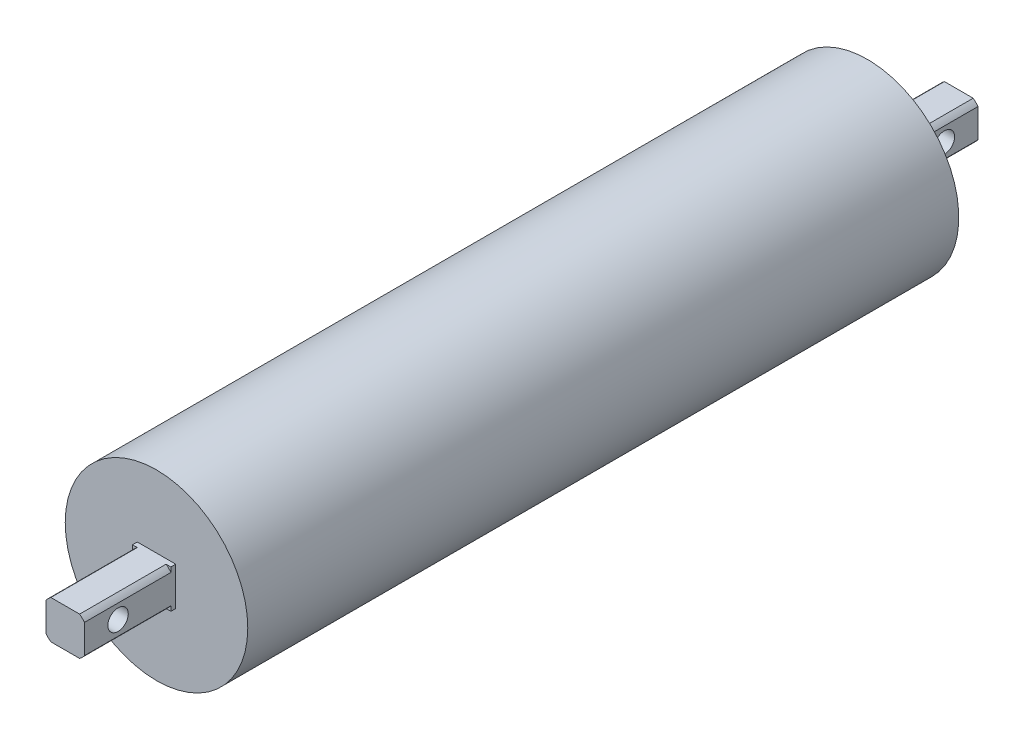
ISO-10303-21;
HEADER;
FILE_DESCRIPTION(('STEP AP214'),'2;1');
FILE_NAME('part.step','',(''),(''),'','','');
FILE_SCHEMA(('AUTOMOTIVE_DESIGN { 1 0 10303 214 1 1 1 1 }'));
ENDSEC;
DATA;
#1=APPLICATION_CONTEXT('core data for automotive mechanical design processes');
#2=APPLICATION_PROTOCOL_DEFINITION('international standard','automotive_design',2000,#1);
#3=PRODUCT_CONTEXT('',#1,'mechanical');
#4=PRODUCT('Part','Part','',(#3));
#5=PRODUCT_RELATED_PRODUCT_CATEGORY('part','',(#4));
#6=PRODUCT_DEFINITION_FORMATION('','',#4);
#7=PRODUCT_DEFINITION_CONTEXT('part definition',#1,'design');
#8=PRODUCT_DEFINITION('design','',#6,#7);
#9=PRODUCT_DEFINITION_SHAPE('','',#8);
#10=(LENGTH_UNIT() NAMED_UNIT(*) SI_UNIT(.MILLI.,.METRE.));
#11=(NAMED_UNIT(*) PLANE_ANGLE_UNIT() SI_UNIT($,.RADIAN.));
#12=(NAMED_UNIT(*) SI_UNIT($,.STERADIAN.) SOLID_ANGLE_UNIT());
#13=UNCERTAINTY_MEASURE_WITH_UNIT(LENGTH_MEASURE(1.E-05),#10,'distance_accuracy_value','');
#14=(GEOMETRIC_REPRESENTATION_CONTEXT(3) GLOBAL_UNCERTAINTY_ASSIGNED_CONTEXT((#13)) GLOBAL_UNIT_ASSIGNED_CONTEXT((#10,
#11,#12)) REPRESENTATION_CONTEXT('',''));
#15=CARTESIAN_POINT('',(0.,0.,0.));
#16=DIRECTION('',(0.,0.,1.));
#17=DIRECTION('',(1.,0.,0.));
#18=AXIS2_PLACEMENT_3D('',#15,#16,#17);
#19=CARTESIAN_POINT('',(0.,0.,150.));
#20=DIRECTION('',(0.,0.,-1.));
#21=DIRECTION('',(-1.,0.,0.));
#22=AXIS2_PLACEMENT_3D('',#19,#20,#21);
#23=CYLINDRICAL_SURFACE('',#22,38.);
#24=CARTESIAN_POINT('',(0.,0.,148.));
#25=DIRECTION('',(0.,0.,1.));
#26=DIRECTION('',(1.,0.,0.));
#27=AXIS2_PLACEMENT_3D('',#24,#25,#26);
#28=CIRCLE('',#27,38.);
#29=CARTESIAN_POINT('',(38.,0.,148.));
#30=VERTEX_POINT('',#29);
#31=EDGE_CURVE('E361',#30,#30,#28,.T.);
#32=ORIENTED_EDGE('',*,*,#31,.F.);
#33=EDGE_LOOP('',(#32));
#34=FACE_BOUND('',#33,.T.);
#35=CARTESIAN_POINT('',(0.,0.,-148.));
#36=DIRECTION('',(0.,0.,-1.));
#37=DIRECTION('',(-1.,0.,0.));
#38=AXIS2_PLACEMENT_3D('',#35,#36,#37);
#39=CIRCLE('',#38,38.);
#40=CARTESIAN_POINT('',(-38.,0.,-148.));
#41=VERTEX_POINT('',#40);
#42=EDGE_CURVE('E369',#41,#41,#39,.T.);
#43=ORIENTED_EDGE('',*,*,#42,.F.);
#44=EDGE_LOOP('',(#43));
#45=FACE_BOUND('',#44,.T.);
#46=ADVANCED_FACE('F43',(#34,#45),#23,.T.);
#47=CARTESIAN_POINT('',(0.,0.,148.));
#48=DIRECTION('',(0.,0.,1.));
#49=DIRECTION('',(1.,0.,0.));
#50=AXIS2_PLACEMENT_3D('',#47,#48,#49);
#51=PLANE('',#50);
#52=DIRECTION('',(-1.,0.,0.));
#53=VECTOR('',#52,1.);
#54=CARTESIAN_POINT('',(8.,8.,148.));
#55=LINE('',#54,#53);
#56=CARTESIAN_POINT('',(8.,8.,148.));
#57=VERTEX_POINT('',#56);
#58=CARTESIAN_POINT('',(-8.,8.,148.));
#59=VERTEX_POINT('',#58);
#60=EDGE_CURVE('E293',#57,#59,#55,.T.);
#61=ORIENTED_EDGE('',*,*,#60,.F.);
#62=DIRECTION('',(0.,1.,0.));
#63=VECTOR('',#62,1.);
#64=CARTESIAN_POINT('',(8.,-8.,148.));
#65=LINE('',#64,#63);
#66=CARTESIAN_POINT('',(8.,-8.,148.));
#67=VERTEX_POINT('',#66);
#68=EDGE_CURVE('E290',#67,#57,#65,.T.);
#69=ORIENTED_EDGE('',*,*,#68,.F.);
#70=DIRECTION('',(1.,0.,0.));
#71=VECTOR('',#70,1.);
#72=CARTESIAN_POINT('',(8.,-8.,148.));
#73=LINE('',#72,#71);
#74=CARTESIAN_POINT('',(-8.,-8.,148.));
#75=VERTEX_POINT('',#74);
#76=EDGE_CURVE('E287',#75,#67,#73,.T.);
#77=ORIENTED_EDGE('',*,*,#76,.F.);
#78=DIRECTION('',(0.,-1.,0.));
#79=VECTOR('',#78,1.);
#80=CARTESIAN_POINT('',(-8.,-8.,148.));
#81=LINE('',#80,#79);
#82=EDGE_CURVE('E284',#59,#75,#81,.T.);
#83=ORIENTED_EDGE('',*,*,#82,.F.);
#84=EDGE_LOOP('',(#61,#69,#77,#83));
#85=FACE_BOUND('',#84,.T.);
#86=ORIENTED_EDGE('',*,*,#31,.T.);
#87=EDGE_LOOP('',(#86));
#88=FACE_BOUND('',#87,.T.);
#89=ADVANCED_FACE('F436',(#85,#88),#51,.T.);
#90=CARTESIAN_POINT('',(-8.,-8.,148.));
#91=DIRECTION('',(-1.,0.,0.));
#92=DIRECTION('',(0.,-1.,0.));
#93=AXIS2_PLACEMENT_3D('',#90,#91,#92);
#94=PLANE('',#93);
#95=CARTESIAN_POINT('',(-8.,0.,172.));
#96=DIRECTION('',(-1.,0.,0.));
#97=DIRECTION('',(0.,0.,1.));
#98=AXIS2_PLACEMENT_3D('',#95,#96,#97);
#99=CIRCLE('',#98,4.24999999999999);
#100=CARTESIAN_POINT('',(-8.,0.,176.25));
#101=VERTEX_POINT('',#100);
#102=EDGE_CURVE('E273',#101,#101,#99,.T.);
#103=ORIENTED_EDGE('',*,*,#102,.F.);
#104=EDGE_LOOP('',(#103));
#105=FACE_BOUND('',#104,.T.);
#106=DIRECTION('',(0.,0.,1.));
#107=VECTOR('',#106,1.);
#108=CARTESIAN_POINT('',(-8.,8.,148.));
#109=LINE('',#108,#107);
#110=CARTESIAN_POINT('',(-8.,8.,150.));
#111=VERTEX_POINT('',#110);
#112=EDGE_CURVE('E297',#59,#111,#109,.T.);
#113=ORIENTED_EDGE('',*,*,#112,.F.);
#114=ORIENTED_EDGE('',*,*,#82,.T.);
#115=DIRECTION('',(0.,0.,1.));
#116=VECTOR('',#115,1.);
#117=CARTESIAN_POINT('',(-8.,-8.,148.));
#118=LINE('',#117,#116);
#119=CARTESIAN_POINT('',(-8.,-8.,150.));
#120=VERTEX_POINT('',#119);
#121=EDGE_CURVE('E296',#75,#120,#118,.T.);
#122=ORIENTED_EDGE('',*,*,#121,.T.);
#123=DIRECTION('',(0.,-1.,0.));
#124=VECTOR('',#123,1.);
#125=CARTESIAN_POINT('',(-8.,0.,150.));
#126=LINE('',#125,#124);
#127=CARTESIAN_POINT('',(-8.,-6.,150.));
#128=VERTEX_POINT('',#127);
#129=EDGE_CURVE('E333',#128,#120,#126,.T.);
#130=ORIENTED_EDGE('',*,*,#129,.F.);
#131=DIRECTION('',(0.,0.,-1.));
#132=VECTOR('',#131,1.);
#133=CARTESIAN_POINT('',(-8.,-6.,186.));
#134=LINE('',#133,#132);
#135=CARTESIAN_POINT('',(-8.,-6.,186.));
#136=VERTEX_POINT('',#135);
#137=EDGE_CURVE('E331',#128,#136,#134,.F.);
#138=ORIENTED_EDGE('',*,*,#137,.T.);
#139=DIRECTION('',(0.,-1.,0.));
#140=VECTOR('',#139,1.);
#141=CARTESIAN_POINT('',(-8.,0.,186.));
#142=LINE('',#141,#140);
#143=CARTESIAN_POINT('',(-8.,6.,186.));
#144=VERTEX_POINT('',#143);
#145=EDGE_CURVE('E357',#144,#136,#142,.T.);
#146=ORIENTED_EDGE('',*,*,#145,.F.);
#147=DIRECTION('',(0.,0.,-1.));
#148=VECTOR('',#147,1.);
#149=CARTESIAN_POINT('',(-8.,6.,186.));
#150=LINE('',#149,#148);
#151=CARTESIAN_POINT('',(-8.,6.,150.));
#152=VERTEX_POINT('',#151);
#153=EDGE_CURVE('E336',#144,#152,#150,.T.);
#154=ORIENTED_EDGE('',*,*,#153,.T.);
#155=EDGE_CURVE('E337',#111,#152,#126,.T.);
#156=ORIENTED_EDGE('',*,*,#155,.F.);
#157=EDGE_LOOP('',(#113,#114,#122,#130,#138,#146,#154,#156));
#158=FACE_BOUND('',#157,.T.);
#159=ADVANCED_FACE('F443',(#105,#158),#94,.T.);
#160=CARTESIAN_POINT('',(8.,8.,148.));
#161=DIRECTION('',(0.,1.,0.));
#162=DIRECTION('',(-1.,0.,0.));
#163=AXIS2_PLACEMENT_3D('',#160,#161,#162);
#164=PLANE('',#163);
#165=DIRECTION('',(0.,0.,1.));
#166=VECTOR('',#165,1.);
#167=CARTESIAN_POINT('',(8.,8.,148.));
#168=LINE('',#167,#166);
#169=CARTESIAN_POINT('',(8.,8.,150.));
#170=VERTEX_POINT('',#169);
#171=EDGE_CURVE('E300',#57,#170,#168,.T.);
#172=ORIENTED_EDGE('',*,*,#171,.F.);
#173=ORIENTED_EDGE('',*,*,#60,.T.);
#174=ORIENTED_EDGE('',*,*,#112,.T.);
#175=DIRECTION('',(-1.,0.,0.));
#176=VECTOR('',#175,1.);
#177=CARTESIAN_POINT('',(0.,8.,150.));
#178=LINE('',#177,#176);
#179=CARTESIAN_POINT('',(-6.,8.,150.));
#180=VERTEX_POINT('',#179);
#181=EDGE_CURVE('E325',#180,#111,#178,.T.);
#182=ORIENTED_EDGE('',*,*,#181,.F.);
#183=DIRECTION('',(0.,0.,-1.));
#184=VECTOR('',#183,1.);
#185=CARTESIAN_POINT('',(-6.,8.,186.));
#186=LINE('',#185,#184);
#187=CARTESIAN_POINT('',(-5.99999999999999,8.,186.));
#188=VERTEX_POINT('',#187);
#189=EDGE_CURVE('E323',#180,#188,#186,.F.);
#190=ORIENTED_EDGE('',*,*,#189,.T.);
#191=DIRECTION('',(-1.,0.,0.));
#192=VECTOR('',#191,1.);
#193=CARTESIAN_POINT('',(0.,8.,186.));
#194=LINE('',#193,#192);
#195=CARTESIAN_POINT('',(5.99999999999999,8.,186.));
#196=VERTEX_POINT('',#195);
#197=EDGE_CURVE('E354',#196,#188,#194,.T.);
#198=ORIENTED_EDGE('',*,*,#197,.F.);
#199=DIRECTION('',(0.,0.,-1.));
#200=VECTOR('',#199,1.);
#201=CARTESIAN_POINT('',(5.99999999999999,8.,186.));
#202=LINE('',#201,#200);
#203=CARTESIAN_POINT('',(5.99999999999999,8.,150.));
#204=VERTEX_POINT('',#203);
#205=EDGE_CURVE('E328',#196,#204,#202,.T.);
#206=ORIENTED_EDGE('',*,*,#205,.T.);
#207=EDGE_CURVE('E329',#170,#204,#178,.T.);
#208=ORIENTED_EDGE('',*,*,#207,.F.);
#209=EDGE_LOOP('',(#172,#173,#174,#182,#190,#198,#206,#208));
#210=FACE_BOUND('',#209,.T.);
#211=ADVANCED_FACE('F453',(#210),#164,.T.);
#212=CARTESIAN_POINT('',(8.,-8.,148.));
#213=DIRECTION('',(1.,0.,0.));
#214=DIRECTION('',(0.,1.,0.));
#215=AXIS2_PLACEMENT_3D('',#212,#213,#214);
#216=PLANE('',#215);
#217=CARTESIAN_POINT('',(8.,0.,172.));
#218=DIRECTION('',(1.,0.,0.));
#219=DIRECTION('',(0.,1.,0.));
#220=AXIS2_PLACEMENT_3D('',#217,#218,#219);
#221=CIRCLE('',#220,4.24999999999999);
#222=CARTESIAN_POINT('',(8.,4.24999999999999,172.));
#223=VERTEX_POINT('',#222);
#224=EDGE_CURVE('E283',#223,#223,#221,.T.);
#225=ORIENTED_EDGE('',*,*,#224,.F.);
#226=EDGE_LOOP('',(#225));
#227=FACE_BOUND('',#226,.T.);
#228=DIRECTION('',(0.,0.,1.));
#229=VECTOR('',#228,1.);
#230=CARTESIAN_POINT('',(8.,-8.,148.));
#231=LINE('',#230,#229);
#232=CARTESIAN_POINT('',(8.,-8.,150.));
#233=VERTEX_POINT('',#232);
#234=EDGE_CURVE('E303',#67,#233,#231,.T.);
#235=ORIENTED_EDGE('',*,*,#234,.F.);
#236=ORIENTED_EDGE('',*,*,#68,.T.);
#237=ORIENTED_EDGE('',*,*,#171,.T.);
#238=DIRECTION('',(0.,1.,0.));
#239=VECTOR('',#238,1.);
#240=CARTESIAN_POINT('',(8.,0.,150.));
#241=LINE('',#240,#239);
#242=CARTESIAN_POINT('',(8.,6.,150.));
#243=VERTEX_POINT('',#242);
#244=EDGE_CURVE('E317',#243,#170,#241,.T.);
#245=ORIENTED_EDGE('',*,*,#244,.F.);
#246=DIRECTION('',(0.,0.,-1.));
#247=VECTOR('',#246,1.);
#248=CARTESIAN_POINT('',(8.,6.,186.));
#249=LINE('',#248,#247);
#250=CARTESIAN_POINT('',(8.,6.,186.));
#251=VERTEX_POINT('',#250);
#252=EDGE_CURVE('E315',#243,#251,#249,.F.);
#253=ORIENTED_EDGE('',*,*,#252,.T.);
#254=DIRECTION('',(0.,1.,0.));
#255=VECTOR('',#254,1.);
#256=CARTESIAN_POINT('',(8.,0.,186.));
#257=LINE('',#256,#255);
#258=CARTESIAN_POINT('',(8.,-6.,186.));
#259=VERTEX_POINT('',#258);
#260=EDGE_CURVE('E351',#259,#251,#257,.T.);
#261=ORIENTED_EDGE('',*,*,#260,.F.);
#262=DIRECTION('',(0.,0.,-1.));
#263=VECTOR('',#262,1.);
#264=CARTESIAN_POINT('',(8.,-6.,186.));
#265=LINE('',#264,#263);
#266=CARTESIAN_POINT('',(8.,-6.,150.));
#267=VERTEX_POINT('',#266);
#268=EDGE_CURVE('E320',#259,#267,#265,.T.);
#269=ORIENTED_EDGE('',*,*,#268,.T.);
#270=EDGE_CURVE('E321',#233,#267,#241,.T.);
#271=ORIENTED_EDGE('',*,*,#270,.F.);
#272=EDGE_LOOP('',(#235,#236,#237,#245,#253,#261,#269,#271));
#273=FACE_BOUND('',#272,.T.);
#274=ADVANCED_FACE('F540',(#227,#273),#216,.T.);
#275=CARTESIAN_POINT('',(8.,-8.,148.));
#276=DIRECTION('',(0.,-1.,0.));
#277=DIRECTION('',(1.,0.,0.));
#278=AXIS2_PLACEMENT_3D('',#275,#276,#277);
#279=PLANE('',#278);
#280=ORIENTED_EDGE('',*,*,#121,.F.);
#281=ORIENTED_EDGE('',*,*,#76,.T.);
#282=ORIENTED_EDGE('',*,*,#234,.T.);
#283=DIRECTION('',(1.,0.,0.));
#284=VECTOR('',#283,1.);
#285=CARTESIAN_POINT('',(0.,-8.,150.));
#286=LINE('',#285,#284);
#287=CARTESIAN_POINT('',(6.,-8.,150.));
#288=VERTEX_POINT('',#287);
#289=EDGE_CURVE('E309',#288,#233,#286,.T.);
#290=ORIENTED_EDGE('',*,*,#289,.F.);
#291=DIRECTION('',(0.,0.,-1.));
#292=VECTOR('',#291,1.);
#293=CARTESIAN_POINT('',(6.,-8.,186.));
#294=LINE('',#293,#292);
#295=CARTESIAN_POINT('',(6.,-8.,186.));
#296=VERTEX_POINT('',#295);
#297=EDGE_CURVE('E67',#288,#296,#294,.F.);
#298=ORIENTED_EDGE('',*,*,#297,.T.);
#299=DIRECTION('',(1.,0.,0.));
#300=VECTOR('',#299,1.);
#301=CARTESIAN_POINT('',(0.,-8.,186.));
#302=LINE('',#301,#300);
#303=CARTESIAN_POINT('',(-6.,-8.,186.));
#304=VERTEX_POINT('',#303);
#305=EDGE_CURVE('E348',#304,#296,#302,.T.);
#306=ORIENTED_EDGE('',*,*,#305,.F.);
#307=DIRECTION('',(0.,0.,-1.));
#308=VECTOR('',#307,1.);
#309=CARTESIAN_POINT('',(-6.,-8.,186.));
#310=LINE('',#309,#308);
#311=CARTESIAN_POINT('',(-6.,-8.,150.));
#312=VERTEX_POINT('',#311);
#313=EDGE_CURVE('E312',#304,#312,#310,.T.);
#314=ORIENTED_EDGE('',*,*,#313,.T.);
#315=EDGE_CURVE('E313',#120,#312,#286,.T.);
#316=ORIENTED_EDGE('',*,*,#315,.F.);
#317=EDGE_LOOP('',(#280,#281,#282,#290,#298,#306,#314,#316));
#318=FACE_BOUND('',#317,.T.);
#319=ADVANCED_FACE('F463',(#318),#279,.T.);
#320=CARTESIAN_POINT('',(0.,0.,186.));
#321=DIRECTION('',(0.,0.,1.));
#322=DIRECTION('',(1.,0.,0.));
#323=AXIS2_PLACEMENT_3D('',#320,#321,#322);
#324=PLANE('',#323);
#325=CARTESIAN_POINT('',(0.,0.,186.));
#326=DIRECTION('',(0.,0.,1.));
#327=DIRECTION('',(1.,0.,0.));
#328=AXIS2_PLACEMENT_3D('',#325,#326,#327);
#329=CIRCLE('',#328,10.);
#330=EDGE_CURVE('E343',#188,#144,#329,.T.);
#331=ORIENTED_EDGE('',*,*,#330,.T.);
#332=ORIENTED_EDGE('',*,*,#145,.T.);
#333=EDGE_CURVE('E498',#136,#304,#329,.T.);
#334=ORIENTED_EDGE('',*,*,#333,.T.);
#335=ORIENTED_EDGE('',*,*,#305,.T.);
#336=EDGE_CURVE('E344',#296,#259,#329,.T.);
#337=ORIENTED_EDGE('',*,*,#336,.T.);
#338=ORIENTED_EDGE('',*,*,#260,.T.);
#339=EDGE_CURVE('E339',#251,#196,#329,.T.);
#340=ORIENTED_EDGE('',*,*,#339,.T.);
#341=ORIENTED_EDGE('',*,*,#197,.T.);
#342=EDGE_LOOP('',(#331,#332,#334,#335,#337,#338,#340,#341));
#343=FACE_BOUND('',#342,.T.);
#344=ADVANCED_FACE('F459',(#343),#324,.T.);
#345=CARTESIAN_POINT('',(0.,0.,186.));
#346=DIRECTION('',(0.,0.,-1.));
#347=DIRECTION('',(-1.,0.,0.));
#348=AXIS2_PLACEMENT_3D('',#345,#346,#347);
#349=CYLINDRICAL_SURFACE('',#348,10.);
#350=ORIENTED_EDGE('',*,*,#268,.F.);
#351=ORIENTED_EDGE('',*,*,#336,.F.);
#352=ORIENTED_EDGE('',*,*,#297,.F.);
#353=CARTESIAN_POINT('',(0.,0.,150.));
#354=DIRECTION('',(0.,0.,1.));
#355=DIRECTION('',(1.,0.,0.));
#356=AXIS2_PLACEMENT_3D('',#353,#354,#355);
#357=CIRCLE('',#356,10.);
#358=EDGE_CURVE('E342',#288,#267,#357,.T.);
#359=ORIENTED_EDGE('',*,*,#358,.T.);
#360=EDGE_LOOP('',(#350,#351,#352,#359));
#361=FACE_BOUND('',#360,.T.);
#362=ADVANCED_FACE('F462',(#361),#349,.T.);
#363=ORIENTED_EDGE('',*,*,#137,.F.);
#364=EDGE_CURVE('E516',#128,#312,#357,.T.);
#365=ORIENTED_EDGE('',*,*,#364,.T.);
#366=ORIENTED_EDGE('',*,*,#313,.F.);
#367=ORIENTED_EDGE('',*,*,#333,.F.);
#368=EDGE_LOOP('',(#363,#365,#366,#367));
#369=FACE_BOUND('',#368,.T.);
#370=ADVANCED_FACE('F470',(#369),#349,.T.);
#371=ORIENTED_EDGE('',*,*,#205,.F.);
#372=ORIENTED_EDGE('',*,*,#339,.F.);
#373=ORIENTED_EDGE('',*,*,#252,.F.);
#374=EDGE_CURVE('E345',#243,#204,#357,.T.);
#375=ORIENTED_EDGE('',*,*,#374,.T.);
#376=EDGE_LOOP('',(#371,#372,#373,#375));
#377=FACE_BOUND('',#376,.T.);
#378=ADVANCED_FACE('F468',(#377),#349,.T.);
#379=ORIENTED_EDGE('',*,*,#153,.F.);
#380=ORIENTED_EDGE('',*,*,#330,.F.);
#381=ORIENTED_EDGE('',*,*,#189,.F.);
#382=EDGE_CURVE('E349',#180,#152,#357,.T.);
#383=ORIENTED_EDGE('',*,*,#382,.T.);
#384=EDGE_LOOP('',(#379,#380,#381,#383));
#385=FACE_BOUND('',#384,.T.);
#386=ADVANCED_FACE('F465',(#385),#349,.T.);
#387=CARTESIAN_POINT('',(0.,0.,150.));
#388=DIRECTION('',(0.,0.,1.));
#389=DIRECTION('',(1.,0.,0.));
#390=AXIS2_PLACEMENT_3D('',#387,#388,#389);
#391=PLANE('',#390);
#392=ORIENTED_EDGE('',*,*,#289,.T.);
#393=ORIENTED_EDGE('',*,*,#270,.T.);
#394=ORIENTED_EDGE('',*,*,#358,.F.);
#395=EDGE_LOOP('',(#392,#393,#394));
#396=FACE_BOUND('',#395,.T.);
#397=ADVANCED_FACE('F467',(#396),#391,.T.);
#398=ORIENTED_EDGE('',*,*,#364,.F.);
#399=ORIENTED_EDGE('',*,*,#129,.T.);
#400=ORIENTED_EDGE('',*,*,#315,.T.);
#401=EDGE_LOOP('',(#398,#399,#400));
#402=FACE_BOUND('',#401,.T.);
#403=ADVANCED_FACE('F482',(#402),#391,.T.);
#404=ORIENTED_EDGE('',*,*,#244,.T.);
#405=ORIENTED_EDGE('',*,*,#207,.T.);
#406=ORIENTED_EDGE('',*,*,#374,.F.);
#407=EDGE_LOOP('',(#404,#405,#406));
#408=FACE_BOUND('',#407,.T.);
#409=ADVANCED_FACE('F474',(#408),#391,.T.);
#410=ORIENTED_EDGE('',*,*,#181,.T.);
#411=ORIENTED_EDGE('',*,*,#155,.T.);
#412=ORIENTED_EDGE('',*,*,#382,.F.);
#413=EDGE_LOOP('',(#410,#411,#412));
#414=FACE_BOUND('',#413,.T.);
#415=ADVANCED_FACE('F471',(#414),#391,.T.);
#416=CARTESIAN_POINT('',(-8.,0.,172.));
#417=DIRECTION('',(-1.,0.,0.));
#418=DIRECTION('',(0.,0.,1.));
#419=AXIS2_PLACEMENT_3D('',#416,#417,#418);
#420=CYLINDRICAL_SURFACE('',#419,4.24999999999999);
#421=ORIENTED_EDGE('',*,*,#224,.T.);
#422=EDGE_LOOP('',(#421));
#423=FACE_BOUND('',#422,.T.);
#424=ORIENTED_EDGE('',*,*,#102,.T.);
#425=EDGE_LOOP('',(#424));
#426=FACE_BOUND('',#425,.T.);
#427=ADVANCED_FACE('F473',(#423,#426),#420,.F.);
#428=CARTESIAN_POINT('',(0.,0.,-148.));
#429=DIRECTION('',(0.,0.,-1.));
#430=DIRECTION('',(-1.,0.,0.));
#431=AXIS2_PLACEMENT_3D('',#428,#429,#430);
#432=PLANE('',#431);
#433=DIRECTION('',(0.,-1.,0.));
#434=VECTOR('',#433,1.);
#435=CARTESIAN_POINT('',(-8.,-8.,-148.));
#436=LINE('',#435,#434);
#437=CARTESIAN_POINT('',(-8.,8.,-148.));
#438=VERTEX_POINT('',#437);
#439=CARTESIAN_POINT('',(-8.,-8.,-148.));
#440=VERTEX_POINT('',#439);
#441=EDGE_CURVE('E209',#438,#440,#436,.T.);
#442=ORIENTED_EDGE('',*,*,#441,.T.);
#443=DIRECTION('',(1.,0.,0.));
#444=VECTOR('',#443,1.);
#445=CARTESIAN_POINT('',(8.,-8.,-148.));
#446=LINE('',#445,#444);
#447=CARTESIAN_POINT('',(8.,-8.,-148.));
#448=VERTEX_POINT('',#447);
#449=EDGE_CURVE('E223',#440,#448,#446,.T.);
#450=ORIENTED_EDGE('',*,*,#449,.T.);
#451=DIRECTION('',(0.,1.,0.));
#452=VECTOR('',#451,1.);
#453=CARTESIAN_POINT('',(8.,-8.,-148.));
#454=LINE('',#453,#452);
#455=CARTESIAN_POINT('',(8.,8.,-148.));
#456=VERTEX_POINT('',#455);
#457=EDGE_CURVE('E212',#448,#456,#454,.T.);
#458=ORIENTED_EDGE('',*,*,#457,.T.);
#459=DIRECTION('',(-1.,0.,0.));
#460=VECTOR('',#459,1.);
#461=CARTESIAN_POINT('',(8.,8.,-148.));
#462=LINE('',#461,#460);
#463=EDGE_CURVE('E204',#456,#438,#462,.T.);
#464=ORIENTED_EDGE('',*,*,#463,.T.);
#465=EDGE_LOOP('',(#442,#450,#458,#464));
#466=FACE_BOUND('',#465,.T.);
#467=ORIENTED_EDGE('',*,*,#42,.T.);
#468=EDGE_LOOP('',(#467));
#469=FACE_BOUND('',#468,.T.);
#470=ADVANCED_FACE('F206',(#466,#469),#432,.T.);
#471=CARTESIAN_POINT('',(-8.,-8.,-148.));
#472=DIRECTION('',(1.,0.,0.));
#473=DIRECTION('',(0.,1.,0.));
#474=AXIS2_PLACEMENT_3D('',#471,#472,#473);
#475=PLANE('',#474);
#476=CARTESIAN_POINT('',(-8.,0.,-172.));
#477=DIRECTION('',(-1.,0.,0.));
#478=DIRECTION('',(0.,0.,1.));
#479=AXIS2_PLACEMENT_3D('',#476,#477,#478);
#480=CIRCLE('',#479,4.24999999999999);
#481=CARTESIAN_POINT('',(-8.,0.,-167.75));
#482=VERTEX_POINT('',#481);
#483=EDGE_CURVE('E231',#482,#482,#480,.T.);
#484=ORIENTED_EDGE('',*,*,#483,.F.);
#485=EDGE_LOOP('',(#484));
#486=FACE_BOUND('',#485,.T.);
#487=DIRECTION('',(0.,0.,1.));
#488=VECTOR('',#487,1.);
#489=CARTESIAN_POINT('',(-8.,6.,-186.));
#490=LINE('',#489,#488);
#491=CARTESIAN_POINT('',(-8.,6.,-150.));
#492=VERTEX_POINT('',#491);
#493=CARTESIAN_POINT('',(-8.,6.,-186.));
#494=VERTEX_POINT('',#493);
#495=EDGE_CURVE('E267',#492,#494,#490,.F.);
#496=ORIENTED_EDGE('',*,*,#495,.T.);
#497=DIRECTION('',(0.,-1.,0.));
#498=VECTOR('',#497,1.);
#499=CARTESIAN_POINT('',(-8.,0.,-186.));
#500=LINE('',#499,#498);
#501=CARTESIAN_POINT('',(-8.,-6.,-186.));
#502=VERTEX_POINT('',#501);
#503=EDGE_CURVE('E12',#494,#502,#500,.T.);
#504=ORIENTED_EDGE('',*,*,#503,.T.);
#505=DIRECTION('',(0.,0.,1.));
#506=VECTOR('',#505,1.);
#507=CARTESIAN_POINT('',(-8.,-6.,-186.));
#508=LINE('',#507,#506);
#509=CARTESIAN_POINT('',(-8.,-6.,-150.));
#510=VERTEX_POINT('',#509);
#511=EDGE_CURVE('E262',#502,#510,#508,.T.);
#512=ORIENTED_EDGE('',*,*,#511,.T.);
#513=DIRECTION('',(0.,1.,0.));
#514=VECTOR('',#513,1.);
#515=CARTESIAN_POINT('',(-8.,0.,-150.));
#516=LINE('',#515,#514);
#517=CARTESIAN_POINT('',(-8.,-8.,-150.));
#518=VERTEX_POINT('',#517);
#519=EDGE_CURVE('E264',#518,#510,#516,.T.);
#520=ORIENTED_EDGE('',*,*,#519,.F.);
#521=DIRECTION('',(0.,0.,-1.));
#522=VECTOR('',#521,1.);
#523=CARTESIAN_POINT('',(-8.,-8.,-148.));
#524=LINE('',#523,#522);
#525=EDGE_CURVE('E227',#440,#518,#524,.T.);
#526=ORIENTED_EDGE('',*,*,#525,.F.);
#527=ORIENTED_EDGE('',*,*,#441,.F.);
#528=DIRECTION('',(0.,0.,-1.));
#529=VECTOR('',#528,1.);
#530=CARTESIAN_POINT('',(-8.,8.,-148.));
#531=LINE('',#530,#529);
#532=CARTESIAN_POINT('',(-8.,8.,-150.));
#533=VERTEX_POINT('',#532);
#534=EDGE_CURVE('E216',#438,#533,#531,.T.);
#535=ORIENTED_EDGE('',*,*,#534,.T.);
#536=EDGE_CURVE('E268',#492,#533,#516,.T.);
#537=ORIENTED_EDGE('',*,*,#536,.F.);
#538=EDGE_LOOP('',(#496,#504,#512,#520,#526,#527,#535,#537));
#539=FACE_BOUND('',#538,.T.);
#540=ADVANCED_FACE('F225',(#486,#539),#475,.F.);
#541=CARTESIAN_POINT('',(8.,-8.,-148.));
#542=DIRECTION('',(0.,1.,0.));
#543=DIRECTION('',(-1.,0.,0.));
#544=AXIS2_PLACEMENT_3D('',#541,#542,#543);
#545=PLANE('',#544);
#546=DIRECTION('',(0.,0.,1.));
#547=VECTOR('',#546,1.);
#548=CARTESIAN_POINT('',(-6.,-8.,-186.));
#549=LINE('',#548,#547);
#550=CARTESIAN_POINT('',(-6.,-8.,-150.));
#551=VERTEX_POINT('',#550);
#552=CARTESIAN_POINT('',(-6.,-8.,-186.));
#553=VERTEX_POINT('',#552);
#554=EDGE_CURVE('E259',#551,#553,#549,.F.);
#555=ORIENTED_EDGE('',*,*,#554,.T.);
#556=DIRECTION('',(1.,0.,0.));
#557=VECTOR('',#556,1.);
#558=CARTESIAN_POINT('',(0.,-8.,-186.));
#559=LINE('',#558,#557);
#560=CARTESIAN_POINT('',(6.,-8.,-186.));
#561=VERTEX_POINT('',#560);
#562=EDGE_CURVE('E51',#553,#561,#559,.T.);
#563=ORIENTED_EDGE('',*,*,#562,.T.);
#564=DIRECTION('',(0.,0.,1.));
#565=VECTOR('',#564,1.);
#566=CARTESIAN_POINT('',(6.,-8.,-186.));
#567=LINE('',#566,#565);
#568=CARTESIAN_POINT('',(6.,-8.,-150.));
#569=VERTEX_POINT('',#568);
#570=EDGE_CURVE('E254',#561,#569,#567,.T.);
#571=ORIENTED_EDGE('',*,*,#570,.T.);
#572=DIRECTION('',(-1.,0.,0.));
#573=VECTOR('',#572,1.);
#574=CARTESIAN_POINT('',(0.,-8.,-150.));
#575=LINE('',#574,#573);
#576=CARTESIAN_POINT('',(8.,-8.,-150.));
#577=VERTEX_POINT('',#576);
#578=EDGE_CURVE('E256',#577,#569,#575,.T.);
#579=ORIENTED_EDGE('',*,*,#578,.F.);
#580=DIRECTION('',(0.,0.,-1.));
#581=VECTOR('',#580,1.);
#582=CARTESIAN_POINT('',(8.,-8.,-148.));
#583=LINE('',#582,#581);
#584=EDGE_CURVE('E238',#448,#577,#583,.T.);
#585=ORIENTED_EDGE('',*,*,#584,.F.);
#586=ORIENTED_EDGE('',*,*,#449,.F.);
#587=ORIENTED_EDGE('',*,*,#525,.T.);
#588=EDGE_CURVE('E260',#551,#518,#575,.T.);
#589=ORIENTED_EDGE('',*,*,#588,.F.);
#590=EDGE_LOOP('',(#555,#563,#571,#579,#585,#586,#587,#589));
#591=FACE_BOUND('',#590,.T.);
#592=ADVANCED_FACE('F417',(#591),#545,.F.);
#593=CARTESIAN_POINT('',(8.,-8.,-148.));
#594=DIRECTION('',(-1.,0.,0.));
#595=DIRECTION('',(0.,-1.,0.));
#596=AXIS2_PLACEMENT_3D('',#593,#594,#595);
#597=PLANE('',#596);
#598=CARTESIAN_POINT('',(8.,0.,-172.));
#599=DIRECTION('',(-1.,0.,0.));
#600=DIRECTION('',(0.,-1.,0.));
#601=AXIS2_PLACEMENT_3D('',#598,#599,#600);
#602=CIRCLE('',#601,4.24999999999999);
#603=CARTESIAN_POINT('',(8.,-4.24999999999999,-172.));
#604=VERTEX_POINT('',#603);
#605=EDGE_CURVE('E46',#604,#604,#602,.T.);
#606=ORIENTED_EDGE('',*,*,#605,.T.);
#607=EDGE_LOOP('',(#606));
#608=FACE_BOUND('',#607,.T.);
#609=DIRECTION('',(0.,0.,1.));
#610=VECTOR('',#609,1.);
#611=CARTESIAN_POINT('',(8.,-6.,-186.));
#612=LINE('',#611,#610);
#613=CARTESIAN_POINT('',(8.,-6.,-150.));
#614=VERTEX_POINT('',#613);
#615=CARTESIAN_POINT('',(8.,-6.,-186.));
#616=VERTEX_POINT('',#615);
#617=EDGE_CURVE('E251',#614,#616,#612,.F.);
#618=ORIENTED_EDGE('',*,*,#617,.T.);
#619=DIRECTION('',(0.,1.,0.));
#620=VECTOR('',#619,1.);
#621=CARTESIAN_POINT('',(8.,0.,-186.));
#622=LINE('',#621,#620);
#623=CARTESIAN_POINT('',(8.,6.,-186.));
#624=VERTEX_POINT('',#623);
#625=EDGE_CURVE('E367',#616,#624,#622,.T.);
#626=ORIENTED_EDGE('',*,*,#625,.T.);
#627=DIRECTION('',(0.,0.,1.));
#628=VECTOR('',#627,1.);
#629=CARTESIAN_POINT('',(8.,6.,-186.));
#630=LINE('',#629,#628);
#631=CARTESIAN_POINT('',(8.,6.,-150.));
#632=VERTEX_POINT('',#631);
#633=EDGE_CURVE('E246',#624,#632,#630,.T.);
#634=ORIENTED_EDGE('',*,*,#633,.T.);
#635=DIRECTION('',(0.,-1.,0.));
#636=VECTOR('',#635,1.);
#637=CARTESIAN_POINT('',(8.,0.,-150.));
#638=LINE('',#637,#636);
#639=CARTESIAN_POINT('',(8.,8.,-150.));
#640=VERTEX_POINT('',#639);
#641=EDGE_CURVE('E248',#640,#632,#638,.T.);
#642=ORIENTED_EDGE('',*,*,#641,.F.);
#643=DIRECTION('',(0.,0.,-1.));
#644=VECTOR('',#643,1.);
#645=CARTESIAN_POINT('',(8.,8.,-148.));
#646=LINE('',#645,#644);
#647=EDGE_CURVE('E222',#456,#640,#646,.T.);
#648=ORIENTED_EDGE('',*,*,#647,.F.);
#649=ORIENTED_EDGE('',*,*,#457,.F.);
#650=ORIENTED_EDGE('',*,*,#584,.T.);
#651=EDGE_CURVE('E252',#614,#577,#638,.T.);
#652=ORIENTED_EDGE('',*,*,#651,.F.);
#653=EDGE_LOOP('',(#618,#626,#634,#642,#648,#649,#650,#652));
#654=FACE_BOUND('',#653,.T.);
#655=ADVANCED_FACE('F405',(#608,#654),#597,.F.);
#656=CARTESIAN_POINT('',(8.,8.,-148.));
#657=DIRECTION('',(0.,-1.,0.));
#658=DIRECTION('',(1.,0.,0.));
#659=AXIS2_PLACEMENT_3D('',#656,#657,#658);
#660=PLANE('',#659);
#661=DIRECTION('',(0.,0.,1.));
#662=VECTOR('',#661,1.);
#663=CARTESIAN_POINT('',(5.99999999999999,8.,-186.));
#664=LINE('',#663,#662);
#665=CARTESIAN_POINT('',(5.99999999999999,8.,-150.));
#666=VERTEX_POINT('',#665);
#667=CARTESIAN_POINT('',(5.99999999999999,8.,-186.));
#668=VERTEX_POINT('',#667);
#669=EDGE_CURVE('E59',#666,#668,#664,.F.);
#670=ORIENTED_EDGE('',*,*,#669,.T.);
#671=DIRECTION('',(-1.,0.,0.));
#672=VECTOR('',#671,1.);
#673=CARTESIAN_POINT('',(0.,8.,-186.));
#674=LINE('',#673,#672);
#675=CARTESIAN_POINT('',(-5.99999999999999,8.,-186.));
#676=VERTEX_POINT('',#675);
#677=EDGE_CURVE('E360',#668,#676,#674,.T.);
#678=ORIENTED_EDGE('',*,*,#677,.T.);
#679=DIRECTION('',(0.,0.,1.));
#680=VECTOR('',#679,1.);
#681=CARTESIAN_POINT('',(-6.,8.,-186.));
#682=LINE('',#681,#680);
#683=CARTESIAN_POINT('',(-6.,8.,-150.));
#684=VERTEX_POINT('',#683);
#685=EDGE_CURVE('E237',#676,#684,#682,.T.);
#686=ORIENTED_EDGE('',*,*,#685,.T.);
#687=DIRECTION('',(1.,0.,0.));
#688=VECTOR('',#687,1.);
#689=CARTESIAN_POINT('',(0.,8.,-150.));
#690=LINE('',#689,#688);
#691=EDGE_CURVE('E219',#533,#684,#690,.T.);
#692=ORIENTED_EDGE('',*,*,#691,.F.);
#693=ORIENTED_EDGE('',*,*,#534,.F.);
#694=ORIENTED_EDGE('',*,*,#463,.F.);
#695=ORIENTED_EDGE('',*,*,#647,.T.);
#696=EDGE_CURVE('E244',#666,#640,#690,.T.);
#697=ORIENTED_EDGE('',*,*,#696,.F.);
#698=EDGE_LOOP('',(#670,#678,#686,#692,#693,#694,#695,#697));
#699=FACE_BOUND('',#698,.T.);
#700=ADVANCED_FACE('F217',(#699),#660,.F.);
#701=CARTESIAN_POINT('',(0.,0.,-186.));
#702=DIRECTION('',(0.,0.,-1.));
#703=DIRECTION('',(1.,0.,0.));
#704=AXIS2_PLACEMENT_3D('',#701,#702,#703);
#705=PLANE('',#704);
#706=ORIENTED_EDGE('',*,*,#503,.F.);
#707=CARTESIAN_POINT('',(0.,0.,-186.));
#708=DIRECTION('',(0.,0.,1.));
#709=DIRECTION('',(1.,0.,0.));
#710=AXIS2_PLACEMENT_3D('',#707,#708,#709);
#711=CIRCLE('',#710,10.);
#712=EDGE_CURVE('E274',#676,#494,#711,.T.);
#713=ORIENTED_EDGE('',*,*,#712,.F.);
#714=ORIENTED_EDGE('',*,*,#677,.F.);
#715=EDGE_CURVE('E270',#624,#668,#711,.T.);
#716=ORIENTED_EDGE('',*,*,#715,.F.);
#717=ORIENTED_EDGE('',*,*,#625,.F.);
#718=EDGE_CURVE('E275',#561,#616,#711,.T.);
#719=ORIENTED_EDGE('',*,*,#718,.F.);
#720=ORIENTED_EDGE('',*,*,#562,.F.);
#721=EDGE_CURVE('E386',#502,#553,#711,.T.);
#722=ORIENTED_EDGE('',*,*,#721,.F.);
#723=EDGE_LOOP('',(#706,#713,#714,#716,#717,#719,#720,#722));
#724=FACE_BOUND('',#723,.T.);
#725=ADVANCED_FACE('F401',(#724),#705,.T.);
#726=CARTESIAN_POINT('',(0.,0.,-186.));
#727=DIRECTION('',(0.,0.,1.));
#728=DIRECTION('',(1.,0.,0.));
#729=AXIS2_PLACEMENT_3D('',#726,#727,#728);
#730=CYLINDRICAL_SURFACE('',#729,10.);
#731=ORIENTED_EDGE('',*,*,#495,.F.);
#732=CARTESIAN_POINT('',(0.,0.,-150.));
#733=DIRECTION('',(0.,0.,1.));
#734=DIRECTION('',(1.,0.,0.));
#735=AXIS2_PLACEMENT_3D('',#732,#733,#734);
#736=CIRCLE('',#735,10.);
#737=EDGE_CURVE('E279',#684,#492,#736,.T.);
#738=ORIENTED_EDGE('',*,*,#737,.F.);
#739=ORIENTED_EDGE('',*,*,#685,.F.);
#740=ORIENTED_EDGE('',*,*,#712,.T.);
#741=EDGE_LOOP('',(#731,#738,#739,#740));
#742=FACE_BOUND('',#741,.T.);
#743=ADVANCED_FACE('F382',(#742),#730,.T.);
#744=ORIENTED_EDGE('',*,*,#633,.F.);
#745=ORIENTED_EDGE('',*,*,#715,.T.);
#746=ORIENTED_EDGE('',*,*,#669,.F.);
#747=EDGE_CURVE('E276',#632,#666,#736,.T.);
#748=ORIENTED_EDGE('',*,*,#747,.F.);
#749=EDGE_LOOP('',(#744,#745,#746,#748));
#750=FACE_BOUND('',#749,.T.);
#751=ADVANCED_FACE('F408',(#750),#730,.T.);
#752=ORIENTED_EDGE('',*,*,#570,.F.);
#753=ORIENTED_EDGE('',*,*,#718,.T.);
#754=ORIENTED_EDGE('',*,*,#617,.F.);
#755=EDGE_CURVE('E280',#569,#614,#736,.T.);
#756=ORIENTED_EDGE('',*,*,#755,.F.);
#757=EDGE_LOOP('',(#752,#753,#754,#756));
#758=FACE_BOUND('',#757,.T.);
#759=ADVANCED_FACE('F397',(#758),#730,.T.);
#760=ORIENTED_EDGE('',*,*,#511,.F.);
#761=ORIENTED_EDGE('',*,*,#721,.T.);
#762=ORIENTED_EDGE('',*,*,#554,.F.);
#763=EDGE_CURVE('E373',#510,#551,#736,.T.);
#764=ORIENTED_EDGE('',*,*,#763,.F.);
#765=EDGE_LOOP('',(#760,#761,#762,#764));
#766=FACE_BOUND('',#765,.T.);
#767=ADVANCED_FACE('F421',(#766),#730,.T.);
#768=CARTESIAN_POINT('',(0.,0.,-150.));
#769=DIRECTION('',(0.,0.,1.));
#770=DIRECTION('',(1.,0.,0.));
#771=AXIS2_PLACEMENT_3D('',#768,#769,#770);
#772=PLANE('',#771);
#773=ORIENTED_EDGE('',*,*,#696,.T.);
#774=ORIENTED_EDGE('',*,*,#641,.T.);
#775=ORIENTED_EDGE('',*,*,#747,.T.);
#776=EDGE_LOOP('',(#773,#774,#775));
#777=FACE_BOUND('',#776,.T.);
#778=ADVANCED_FACE('F411',(#777),#772,.F.);
#779=ORIENTED_EDGE('',*,*,#737,.T.);
#780=ORIENTED_EDGE('',*,*,#536,.T.);
#781=ORIENTED_EDGE('',*,*,#691,.T.);
#782=EDGE_LOOP('',(#779,#780,#781));
#783=FACE_BOUND('',#782,.T.);
#784=ADVANCED_FACE('F376',(#783),#772,.F.);
#785=ORIENTED_EDGE('',*,*,#651,.T.);
#786=ORIENTED_EDGE('',*,*,#578,.T.);
#787=ORIENTED_EDGE('',*,*,#755,.T.);
#788=EDGE_LOOP('',(#785,#786,#787));
#789=FACE_BOUND('',#788,.T.);
#790=ADVANCED_FACE('F416',(#789),#772,.F.);
#791=ORIENTED_EDGE('',*,*,#588,.T.);
#792=ORIENTED_EDGE('',*,*,#519,.T.);
#793=ORIENTED_EDGE('',*,*,#763,.T.);
#794=EDGE_LOOP('',(#791,#792,#793));
#795=FACE_BOUND('',#794,.T.);
#796=ADVANCED_FACE('F423',(#795),#772,.F.);
#797=CARTESIAN_POINT('',(-8.,0.,-172.));
#798=DIRECTION('',(-1.,0.,0.));
#799=DIRECTION('',(0.,0.,1.));
#800=AXIS2_PLACEMENT_3D('',#797,#798,#799);
#801=CYLINDRICAL_SURFACE('',#800,4.24999999999999);
#802=ORIENTED_EDGE('',*,*,#483,.T.);
#803=EDGE_LOOP('',(#802));
#804=FACE_BOUND('',#803,.T.);
#805=ORIENTED_EDGE('',*,*,#605,.F.);
#806=EDGE_LOOP('',(#805));
#807=FACE_BOUND('',#806,.T.);
#808=ADVANCED_FACE('F425',(#804,#807),#801,.F.);
#809=CLOSED_SHELL('',(#46,#89,#159,#211,#274,#319,#344,#362,#370,#378,#386,#397,#403,#409,#415,
#427,#470,#540,#592,#655,#700,#725,#743,#751,#759,#767,#778,#784,#790,#796,#808));
#810=MANIFOLD_SOLID_BREP('B2',#809);
#811=ADVANCED_BREP_SHAPE_REPRESENTATION('',(#18,#810),#14);
#812=SHAPE_DEFINITION_REPRESENTATION(#9,#811);
ENDSEC;
END-ISO-10303-21;
